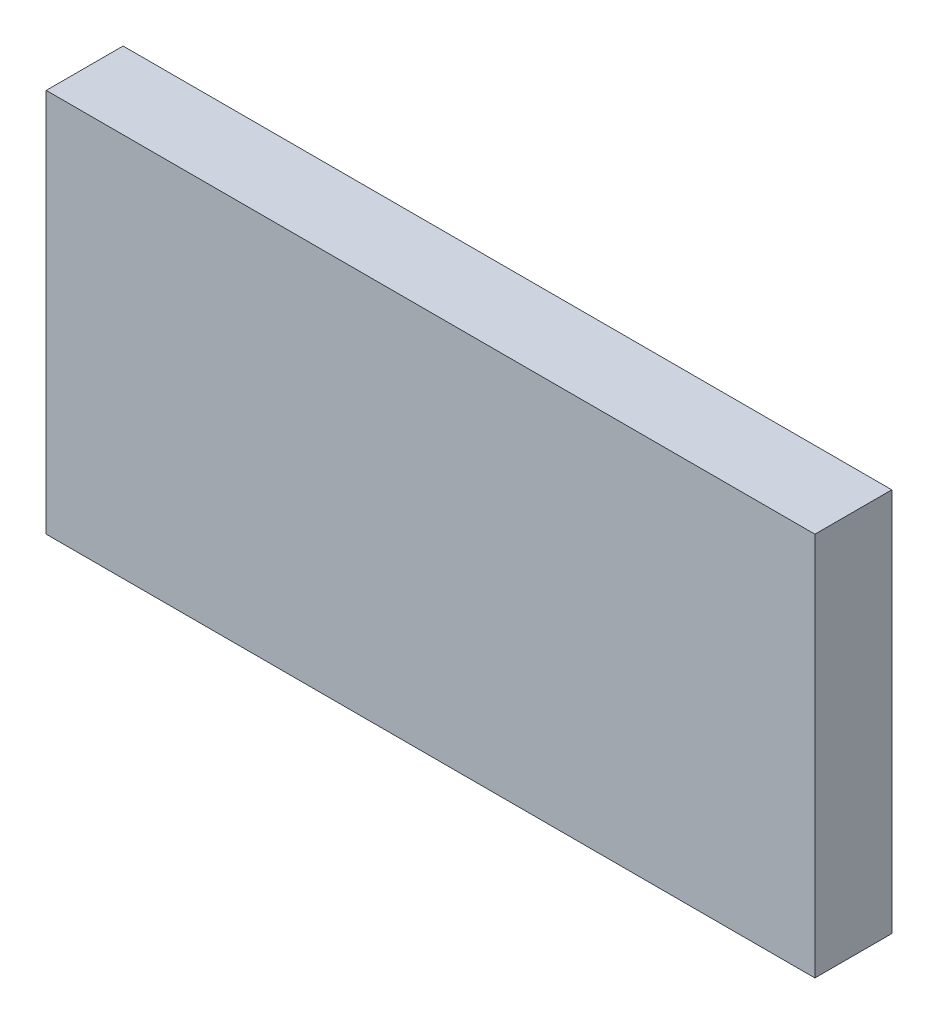
ISO-10303-21;
HEADER;
FILE_DESCRIPTION(('STEP AP214'),'2;1');
FILE_NAME('part.step','',(''),(''),'','','');
FILE_SCHEMA(('AUTOMOTIVE_DESIGN { 1 0 10303 214 1 1 1 1 }'));
ENDSEC;
DATA;
#1=APPLICATION_CONTEXT('core data for automotive mechanical design processes');
#2=APPLICATION_PROTOCOL_DEFINITION('international standard','automotive_design',2000,#1);
#3=PRODUCT_CONTEXT('',#1,'mechanical');
#4=PRODUCT('Part','Part','',(#3));
#5=PRODUCT_RELATED_PRODUCT_CATEGORY('part','',(#4));
#6=PRODUCT_DEFINITION_FORMATION('','',#4);
#7=PRODUCT_DEFINITION_CONTEXT('part definition',#1,'design');
#8=PRODUCT_DEFINITION('design','',#6,#7);
#9=PRODUCT_DEFINITION_SHAPE('','',#8);
#10=(LENGTH_UNIT() NAMED_UNIT(*) SI_UNIT(.MILLI.,.METRE.));
#11=(NAMED_UNIT(*) PLANE_ANGLE_UNIT() SI_UNIT($,.RADIAN.));
#12=(NAMED_UNIT(*) SI_UNIT($,.STERADIAN.) SOLID_ANGLE_UNIT());
#13=UNCERTAINTY_MEASURE_WITH_UNIT(LENGTH_MEASURE(1.E-05),#10,'distance_accuracy_value','');
#14=(GEOMETRIC_REPRESENTATION_CONTEXT(3) GLOBAL_UNCERTAINTY_ASSIGNED_CONTEXT((#13)) GLOBAL_UNIT_ASSIGNED_CONTEXT((#10,
#11,#12)) REPRESENTATION_CONTEXT('',''));
#15=CARTESIAN_POINT('',(0.,0.,0.));
#16=DIRECTION('',(0.,0.,1.));
#17=DIRECTION('',(1.,0.,0.));
#18=AXIS2_PLACEMENT_3D('',#15,#16,#17);
#19=CARTESIAN_POINT('',(0.,0.,4.));
#20=DIRECTION('',(1.,0.,0.));
#21=DIRECTION('',(0.,0.,-1.));
#22=AXIS2_PLACEMENT_3D('',#19,#20,#21);
#23=PLANE('',#22);
#24=DIRECTION('',(0.,-1.,0.));
#25=VECTOR('',#24,1.);
#26=CARTESIAN_POINT('',(0.,0.,0.));
#27=LINE('',#26,#25);
#28=CARTESIAN_POINT('',(0.,20.,0.));
#29=VERTEX_POINT('',#28);
#30=CARTESIAN_POINT('',(0.,0.,0.));
#31=VERTEX_POINT('',#30);
#32=EDGE_CURVE('E106',#29,#31,#27,.T.);
#33=ORIENTED_EDGE('',*,*,#32,.T.);
#34=DIRECTION('',(0.,0.,-1.));
#35=VECTOR('',#34,1.);
#36=CARTESIAN_POINT('',(0.,0.,4.));
#37=LINE('',#36,#35);
#38=CARTESIAN_POINT('',(0.,0.,4.));
#39=VERTEX_POINT('',#38);
#40=EDGE_CURVE('E11',#39,#31,#37,.T.);
#41=ORIENTED_EDGE('',*,*,#40,.F.);
#42=DIRECTION('',(0.,-1.,0.));
#43=VECTOR('',#42,1.);
#44=CARTESIAN_POINT('',(0.,0.,4.));
#45=LINE('',#44,#43);
#46=CARTESIAN_POINT('',(0.,20.,4.));
#47=VERTEX_POINT('',#46);
#48=EDGE_CURVE('E92',#47,#39,#45,.T.);
#49=ORIENTED_EDGE('',*,*,#48,.F.);
#50=DIRECTION('',(0.,0.,-1.));
#51=VECTOR('',#50,1.);
#52=CARTESIAN_POINT('',(0.,20.,4.));
#53=LINE('',#52,#51);
#54=EDGE_CURVE('E105',#47,#29,#53,.T.);
#55=ORIENTED_EDGE('',*,*,#54,.T.);
#56=EDGE_LOOP('',(#33,#41,#49,#55));
#57=FACE_BOUND('',#56,.T.);
#58=ADVANCED_FACE('F43',(#57),#23,.F.);
#59=CARTESIAN_POINT('',(0.,0.,4.));
#60=DIRECTION('',(0.,1.,0.));
#61=DIRECTION('',(0.,0.,1.));
#62=AXIS2_PLACEMENT_3D('',#59,#60,#61);
#63=PLANE('',#62);
#64=DIRECTION('',(1.,0.,0.));
#65=VECTOR('',#64,1.);
#66=CARTESIAN_POINT('',(0.,0.,0.));
#67=LINE('',#66,#65);
#68=CARTESIAN_POINT('',(40.,0.,0.));
#69=VERTEX_POINT('',#68);
#70=EDGE_CURVE('E97',#31,#69,#67,.T.);
#71=ORIENTED_EDGE('',*,*,#70,.T.);
#72=DIRECTION('',(0.,0.,-1.));
#73=VECTOR('',#72,1.);
#74=CARTESIAN_POINT('',(40.,0.,4.));
#75=LINE('',#74,#73);
#76=CARTESIAN_POINT('',(40.,0.,4.));
#77=VERTEX_POINT('',#76);
#78=EDGE_CURVE('E51',#77,#69,#75,.T.);
#79=ORIENTED_EDGE('',*,*,#78,.F.);
#80=DIRECTION('',(1.,0.,0.));
#81=VECTOR('',#80,1.);
#82=CARTESIAN_POINT('',(0.,0.,4.));
#83=LINE('',#82,#81);
#84=EDGE_CURVE('E87',#39,#77,#83,.T.);
#85=ORIENTED_EDGE('',*,*,#84,.F.);
#86=ORIENTED_EDGE('',*,*,#40,.T.);
#87=EDGE_LOOP('',(#71,#79,#85,#86));
#88=FACE_BOUND('',#87,.T.);
#89=ADVANCED_FACE('F100',(#88),#63,.F.);
#90=CARTESIAN_POINT('',(40.,0.,4.));
#91=DIRECTION('',(-1.,0.,0.));
#92=DIRECTION('',(0.,0.,1.));
#93=AXIS2_PLACEMENT_3D('',#90,#91,#92);
#94=PLANE('',#93);
#95=DIRECTION('',(0.,1.,0.));
#96=VECTOR('',#95,1.);
#97=CARTESIAN_POINT('',(40.,0.,0.));
#98=LINE('',#97,#96);
#99=CARTESIAN_POINT('',(40.,20.,0.));
#100=VERTEX_POINT('',#99);
#101=EDGE_CURVE('E78',#69,#100,#98,.T.);
#102=ORIENTED_EDGE('',*,*,#101,.T.);
#103=DIRECTION('',(0.,0.,-1.));
#104=VECTOR('',#103,1.);
#105=CARTESIAN_POINT('',(40.,20.,4.));
#106=LINE('',#105,#104);
#107=CARTESIAN_POINT('',(40.,20.,4.));
#108=VERTEX_POINT('',#107);
#109=EDGE_CURVE('E98',#108,#100,#106,.T.);
#110=ORIENTED_EDGE('',*,*,#109,.F.);
#111=DIRECTION('',(0.,1.,0.));
#112=VECTOR('',#111,1.);
#113=CARTESIAN_POINT('',(40.,0.,4.));
#114=LINE('',#113,#112);
#115=EDGE_CURVE('E95',#77,#108,#114,.T.);
#116=ORIENTED_EDGE('',*,*,#115,.F.);
#117=ORIENTED_EDGE('',*,*,#78,.T.);
#118=EDGE_LOOP('',(#102,#110,#116,#117));
#119=FACE_BOUND('',#118,.T.);
#120=ADVANCED_FACE('F99',(#119),#94,.F.);
#121=CARTESIAN_POINT('',(0.,20.,4.));
#122=DIRECTION('',(0.,-1.,0.));
#123=DIRECTION('',(0.,0.,-1.));
#124=AXIS2_PLACEMENT_3D('',#121,#122,#123);
#125=PLANE('',#124);
#126=DIRECTION('',(-1.,0.,0.));
#127=VECTOR('',#126,1.);
#128=CARTESIAN_POINT('',(0.,20.,0.));
#129=LINE('',#128,#127);
#130=EDGE_CURVE('E85',#100,#29,#129,.T.);
#131=ORIENTED_EDGE('',*,*,#130,.T.);
#132=ORIENTED_EDGE('',*,*,#54,.F.);
#133=DIRECTION('',(-1.,0.,0.));
#134=VECTOR('',#133,1.);
#135=CARTESIAN_POINT('',(0.,20.,4.));
#136=LINE('',#135,#134);
#137=EDGE_CURVE('E56',#108,#47,#136,.T.);
#138=ORIENTED_EDGE('',*,*,#137,.F.);
#139=ORIENTED_EDGE('',*,*,#109,.T.);
#140=EDGE_LOOP('',(#131,#132,#138,#139));
#141=FACE_BOUND('',#140,.T.);
#142=ADVANCED_FACE('F111',(#141),#125,.F.);
#143=CARTESIAN_POINT('',(0.,0.,4.));
#144=DIRECTION('',(0.,0.,-1.));
#145=DIRECTION('',(-1.,0.,0.));
#146=AXIS2_PLACEMENT_3D('',#143,#144,#145);
#147=PLANE('',#146);
#148=ORIENTED_EDGE('',*,*,#48,.T.);
#149=ORIENTED_EDGE('',*,*,#84,.T.);
#150=ORIENTED_EDGE('',*,*,#115,.T.);
#151=ORIENTED_EDGE('',*,*,#137,.T.);
#152=EDGE_LOOP('',(#148,#149,#150,#151));
#153=FACE_BOUND('',#152,.T.);
#154=ADVANCED_FACE('F89',(#153),#147,.F.);
#155=CARTESIAN_POINT('',(0.,0.,0.));
#156=DIRECTION('',(0.,0.,-1.));
#157=DIRECTION('',(-1.,0.,0.));
#158=AXIS2_PLACEMENT_3D('',#155,#156,#157);
#159=PLANE('',#158);
#160=ORIENTED_EDGE('',*,*,#32,.F.);
#161=ORIENTED_EDGE('',*,*,#130,.F.);
#162=ORIENTED_EDGE('',*,*,#101,.F.);
#163=ORIENTED_EDGE('',*,*,#70,.F.);
#164=EDGE_LOOP('',(#160,#161,#162,#163));
#165=FACE_BOUND('',#164,.T.);
#166=ADVANCED_FACE('F116',(#165),#159,.T.);
#167=CLOSED_SHELL('',(#58,#89,#120,#142,#154,#166));
#168=MANIFOLD_SOLID_BREP('B2',#167);
#169=ADVANCED_BREP_SHAPE_REPRESENTATION('',(#18,#168),#14);
#170=SHAPE_DEFINITION_REPRESENTATION(#9,#169);
ENDSEC;
END-ISO-10303-21;
